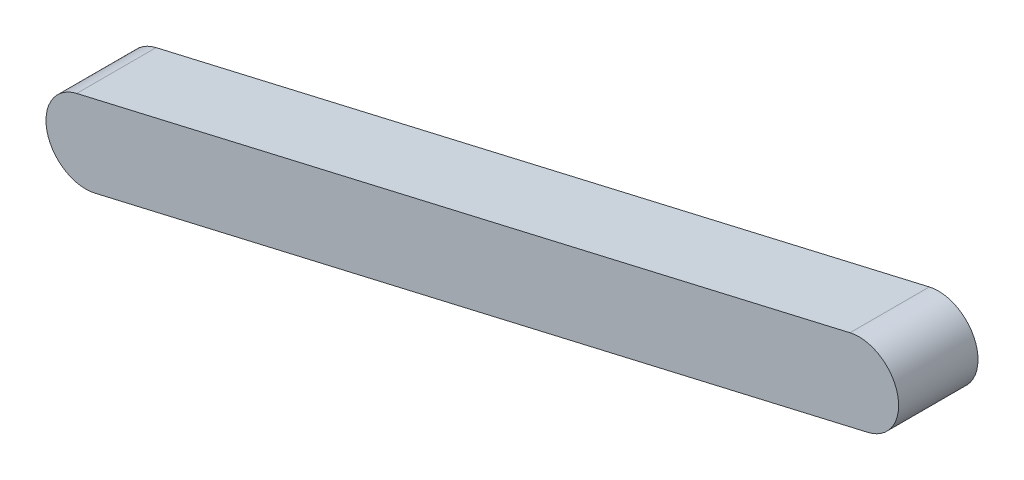
ISO-10303-21;
HEADER;
FILE_DESCRIPTION(('STEP AP214'),'2;1');
FILE_NAME('part.step','',(''),(''),'','','');
FILE_SCHEMA(('AUTOMOTIVE_DESIGN { 1 0 10303 214 1 1 1 1 }'));
ENDSEC;
DATA;
#1=APPLICATION_CONTEXT('core data for automotive mechanical design processes');
#2=APPLICATION_PROTOCOL_DEFINITION('international standard','automotive_design',2000,#1);
#3=PRODUCT_CONTEXT('',#1,'mechanical');
#4=PRODUCT('Part','Part','',(#3));
#5=PRODUCT_RELATED_PRODUCT_CATEGORY('part','',(#4));
#6=PRODUCT_DEFINITION_FORMATION('','',#4);
#7=PRODUCT_DEFINITION_CONTEXT('part definition',#1,'design');
#8=PRODUCT_DEFINITION('design','',#6,#7);
#9=PRODUCT_DEFINITION_SHAPE('','',#8);
#10=(LENGTH_UNIT() NAMED_UNIT(*) SI_UNIT(.MILLI.,.METRE.));
#11=(NAMED_UNIT(*) PLANE_ANGLE_UNIT() SI_UNIT($,.RADIAN.));
#12=(NAMED_UNIT(*) SI_UNIT($,.STERADIAN.) SOLID_ANGLE_UNIT());
#13=UNCERTAINTY_MEASURE_WITH_UNIT(LENGTH_MEASURE(1.E-05),#10,'distance_accuracy_value','');
#14=(GEOMETRIC_REPRESENTATION_CONTEXT(3) GLOBAL_UNCERTAINTY_ASSIGNED_CONTEXT((#13)) GLOBAL_UNIT_ASSIGNED_CONTEXT((#10,
#11,#12)) REPRESENTATION_CONTEXT('',''));
#15=CARTESIAN_POINT('',(0.,0.,0.));
#16=DIRECTION('',(0.,0.,1.));
#17=DIRECTION('',(1.,0.,0.));
#18=AXIS2_PLACEMENT_3D('',#15,#16,#17);
#19=CARTESIAN_POINT('',(806.57424939,211.291886072,180.));
#20=DIRECTION('',(-0.225968389425082,0.974134634935353,0.));
#21=DIRECTION('',(-0.974134634935353,-0.225968389425082,0.));
#22=AXIS2_PLACEMENT_3D('',#19,#20,#21);
#23=PLANE('',#22);
#24=DIRECTION('',(-0.974134634935353,-0.225968389425082,0.));
#25=VECTOR('',#24,1.);
#26=CARTESIAN_POINT('',(806.57424939,211.291886072,180.));
#27=LINE('',#26,#25);
#28=CARTESIAN_POINT('',(806.574249389726,211.291886072026,180.));
#29=VERTEX_POINT('',#28);
#30=CARTESIAN_POINT('',(611.747322402616,166.098208186501,180.));
#31=VERTEX_POINT('',#30);
#32=EDGE_CURVE('E66',#29,#31,#27,.T.);
#33=ORIENTED_EDGE('',*,*,#32,.T.);
#34=DIRECTION('',(0.,0.,-1.));
#35=VECTOR('',#34,1.);
#36=CARTESIAN_POINT('',(611.747322401663,166.09820818587,190.));
#37=LINE('',#36,#35);
#38=CARTESIAN_POINT('',(611.747322402282,166.098208188249,200.));
#39=VERTEX_POINT('',#38);
#40=EDGE_CURVE('E47',#31,#39,#37,.F.);
#41=ORIENTED_EDGE('',*,*,#40,.T.);
#42=DIRECTION('',(-0.97413463493849,-0.225968389411561,0.));
#43=VECTOR('',#42,1.);
#44=CARTESIAN_POINT('',(806.574249372235,211.29188606868,200.));
#45=LINE('',#44,#43);
#46=CARTESIAN_POINT('',(806.574249389705,211.291886072422,200.));
#47=VERTEX_POINT('',#46);
#48=EDGE_CURVE('E83',#47,#39,#45,.T.);
#49=ORIENTED_EDGE('',*,*,#48,.F.);
#50=DIRECTION('',(0.,0.,1.));
#51=VECTOR('',#50,1.);
#52=CARTESIAN_POINT('',(806.574249388663,211.29188607187,190.));
#53=LINE('',#52,#51);
#54=EDGE_CURVE('E68',#47,#29,#53,.F.);
#55=ORIENTED_EDGE('',*,*,#54,.T.);
#56=EDGE_LOOP('',(#33,#41,#49,#55));
#57=FACE_BOUND('',#56,.T.);
#58=ADVANCED_FACE('F16',(#57),#23,.T.);
#59=CARTESIAN_POINT('',(614.007006298,156.356861837,180.));
#60=DIRECTION('',(0.,0.,1.));
#61=DIRECTION('',(1.,0.,0.));
#62=AXIS2_PLACEMENT_3D('',#59,#60,#61);
#63=CYLINDRICAL_SURFACE('',#62,10.);
#64=ORIENTED_EDGE('',*,*,#40,.F.);
#65=CARTESIAN_POINT('',(614.007006298,156.356861837,180.));
#66=DIRECTION('',(0.,0.,1.));
#67=DIRECTION('',(1.,0.,0.));
#68=AXIS2_PLACEMENT_3D('',#65,#66,#67);
#69=CIRCLE('',#68,10.);
#70=CARTESIAN_POINT('',(616.26669019208,146.615515488019,180.));
#71=VERTEX_POINT('',#70);
#72=EDGE_CURVE('E71',#31,#71,#69,.T.);
#73=ORIENTED_EDGE('',*,*,#72,.T.);
#74=DIRECTION('',(0.,0.,-1.));
#75=VECTOR('',#74,1.);
#76=CARTESIAN_POINT('',(616.266690192,146.615515488,190.));
#77=LINE('',#76,#75);
#78=CARTESIAN_POINT('',(616.266690192126,146.615515487513,200.));
#79=VERTEX_POINT('',#78);
#80=EDGE_CURVE('E53',#79,#71,#77,.T.);
#81=ORIENTED_EDGE('',*,*,#80,.F.);
#82=CARTESIAN_POINT('',(614.007006298,156.356861837,200.));
#83=DIRECTION('',(0.,0.,1.));
#84=DIRECTION('',(1.,0.,0.));
#85=AXIS2_PLACEMENT_3D('',#82,#83,#84);
#86=CIRCLE('',#85,10.);
#87=EDGE_CURVE('E20',#39,#79,#86,.T.);
#88=ORIENTED_EDGE('',*,*,#87,.F.);
#89=EDGE_LOOP('',(#64,#73,#81,#88));
#90=FACE_BOUND('',#89,.T.);
#91=ADVANCED_FACE('F74',(#90),#63,.T.);
#92=CARTESIAN_POINT('',(616.266690192,146.615515488,180.));
#93=DIRECTION('',(0.225968389425082,-0.974134634935353,0.));
#94=DIRECTION('',(0.974134634935353,0.225968389425082,0.));
#95=AXIS2_PLACEMENT_3D('',#92,#93,#94);
#96=PLANE('',#95);
#97=DIRECTION('',(0.974134634935353,0.225968389425082,0.));
#98=VECTOR('',#97,1.);
#99=CARTESIAN_POINT('',(616.266690192,146.615515488,180.));
#100=LINE('',#99,#98);
#101=CARTESIAN_POINT('',(811.093617177486,191.809193372943,180.));
#102=VERTEX_POINT('',#101);
#103=EDGE_CURVE('E72',#71,#102,#100,.T.);
#104=ORIENTED_EDGE('',*,*,#103,.T.);
#105=DIRECTION('',(0.,0.,-1.));
#106=VECTOR('',#105,1.);
#107=CARTESIAN_POINT('',(811.093617175591,191.809193372797,190.));
#108=LINE('',#107,#106);
#109=CARTESIAN_POINT('',(811.093617177846,191.809193371085,200.));
#110=VERTEX_POINT('',#109);
#111=EDGE_CURVE('E35',#102,#110,#108,.F.);
#112=ORIENTED_EDGE('',*,*,#111,.T.);
#113=DIRECTION('',(0.97413463493849,0.225968389411561,0.));
#114=VECTOR('',#113,1.);
#115=CARTESIAN_POINT('',(616.266690210765,146.61551549132,200.));
#116=LINE('',#115,#114);
#117=EDGE_CURVE('E84',#79,#110,#116,.T.);
#118=ORIENTED_EDGE('',*,*,#117,.F.);
#119=ORIENTED_EDGE('',*,*,#80,.T.);
#120=EDGE_LOOP('',(#104,#112,#118,#119));
#121=FACE_BOUND('',#120,.T.);
#122=ADVANCED_FACE('F99',(#121),#96,.T.);
#123=CARTESIAN_POINT('',(602.718044736,145.96569977,200.));
#124=DIRECTION('',(0.,0.,1.));
#125=DIRECTION('',(1.,0.,0.));
#126=AXIS2_PLACEMENT_3D('',#123,#124,#125);
#127=PLANE('',#126);
#128=CARTESIAN_POINT('',(808.833933285,201.550539723,200.));
#129=DIRECTION('',(0.,0.,1.));
#130=DIRECTION('',(1.,0.,0.));
#131=AXIS2_PLACEMENT_3D('',#128,#129,#130);
#132=CIRCLE('',#131,10.);
#133=EDGE_CURVE('E26',#110,#47,#132,.T.);
#134=ORIENTED_EDGE('',*,*,#133,.T.);
#135=ORIENTED_EDGE('',*,*,#48,.T.);
#136=ORIENTED_EDGE('',*,*,#87,.T.);
#137=ORIENTED_EDGE('',*,*,#117,.T.);
#138=EDGE_LOOP('',(#134,#135,#136,#137));
#139=FACE_BOUND('',#138,.T.);
#140=ADVANCED_FACE('F87',(#139),#127,.T.);
#141=CARTESIAN_POINT('',(602.718044736,145.96569977,180.));
#142=DIRECTION('',(0.,0.,1.));
#143=DIRECTION('',(1.,0.,0.));
#144=AXIS2_PLACEMENT_3D('',#141,#142,#143);
#145=PLANE('',#144);
#146=ORIENTED_EDGE('',*,*,#32,.F.);
#147=CARTESIAN_POINT('',(808.833933285,201.550539723,180.));
#148=DIRECTION('',(0.,0.,1.));
#149=DIRECTION('',(1.,0.,0.));
#150=AXIS2_PLACEMENT_3D('',#147,#148,#149);
#151=CIRCLE('',#150,10.);
#152=EDGE_CURVE('E10',#29,#102,#151,.F.);
#153=ORIENTED_EDGE('',*,*,#152,.T.);
#154=ORIENTED_EDGE('',*,*,#103,.F.);
#155=ORIENTED_EDGE('',*,*,#72,.F.);
#156=EDGE_LOOP('',(#146,#153,#154,#155));
#157=FACE_BOUND('',#156,.T.);
#158=ADVANCED_FACE('F18',(#157),#145,.F.);
#159=CARTESIAN_POINT('',(808.833933285,201.550539723,180.));
#160=DIRECTION('',(0.,0.,1.));
#161=DIRECTION('',(1.,0.,0.));
#162=AXIS2_PLACEMENT_3D('',#159,#160,#161);
#163=CYLINDRICAL_SURFACE('',#162,10.);
#164=ORIENTED_EDGE('',*,*,#152,.F.);
#165=ORIENTED_EDGE('',*,*,#54,.F.);
#166=ORIENTED_EDGE('',*,*,#133,.F.);
#167=ORIENTED_EDGE('',*,*,#111,.F.);
#168=EDGE_LOOP('',(#164,#165,#166,#167));
#169=FACE_BOUND('',#168,.T.);
#170=ADVANCED_FACE('F89',(#169),#163,.T.);
#171=CLOSED_SHELL('',(#58,#91,#122,#140,#158,#170));
#172=MANIFOLD_SOLID_BREP('B1',#171);
#173=ADVANCED_BREP_SHAPE_REPRESENTATION('',(#18,#172),#14);
#174=SHAPE_DEFINITION_REPRESENTATION(#9,#173);
ENDSEC;
END-ISO-10303-21;
